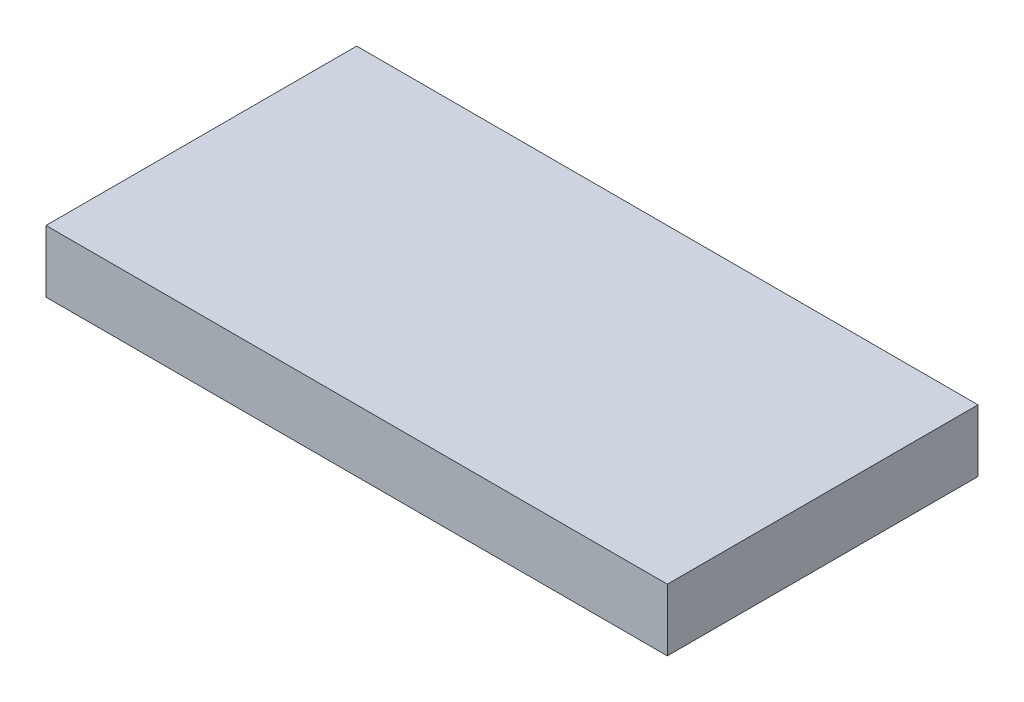
ISO-10303-21;
HEADER;
FILE_DESCRIPTION(('STEP AP214'),'2;1');
FILE_NAME('part.step','',(''),(''),'','','');
FILE_SCHEMA(('AUTOMOTIVE_DESIGN { 1 0 10303 214 1 1 1 1 }'));
ENDSEC;
DATA;
#1=APPLICATION_CONTEXT('core data for automotive mechanical design processes');
#2=APPLICATION_PROTOCOL_DEFINITION('international standard','automotive_design',2000,#1);
#3=PRODUCT_CONTEXT('',#1,'mechanical');
#4=PRODUCT('Part','Part','',(#3));
#5=PRODUCT_RELATED_PRODUCT_CATEGORY('part','',(#4));
#6=PRODUCT_DEFINITION_FORMATION('','',#4);
#7=PRODUCT_DEFINITION_CONTEXT('part definition',#1,'design');
#8=PRODUCT_DEFINITION('design','',#6,#7);
#9=PRODUCT_DEFINITION_SHAPE('','',#8);
#10=(LENGTH_UNIT() NAMED_UNIT(*) SI_UNIT(.MILLI.,.METRE.));
#11=(NAMED_UNIT(*) PLANE_ANGLE_UNIT() SI_UNIT($,.RADIAN.));
#12=(NAMED_UNIT(*) SI_UNIT($,.STERADIAN.) SOLID_ANGLE_UNIT());
#13=UNCERTAINTY_MEASURE_WITH_UNIT(LENGTH_MEASURE(1.E-05),#10,'distance_accuracy_value','');
#14=(GEOMETRIC_REPRESENTATION_CONTEXT(3) GLOBAL_UNCERTAINTY_ASSIGNED_CONTEXT((#13)) GLOBAL_UNIT_ASSIGNED_CONTEXT((#10,
#11,#12)) REPRESENTATION_CONTEXT('',''));
#15=CARTESIAN_POINT('',(0.,0.,0.));
#16=DIRECTION('',(0.,0.,1.));
#17=DIRECTION('',(1.,0.,0.));
#18=AXIS2_PLACEMENT_3D('',#15,#16,#17);
#19=CARTESIAN_POINT('',(16.,3.2,8.));
#20=DIRECTION('',(-1.,0.,0.));
#21=DIRECTION('',(0.,0.,1.));
#22=AXIS2_PLACEMENT_3D('',#19,#20,#21);
#23=PLANE('',#22);
#24=DIRECTION('',(0.,0.,-1.));
#25=VECTOR('',#24,1.);
#26=CARTESIAN_POINT('',(16.,0.,8.));
#27=LINE('',#26,#25);
#28=CARTESIAN_POINT('',(16.,0.,8.));
#29=VERTEX_POINT('',#28);
#30=CARTESIAN_POINT('',(16.,0.,-8.));
#31=VERTEX_POINT('',#30);
#32=EDGE_CURVE('E104',#29,#31,#27,.T.);
#33=ORIENTED_EDGE('',*,*,#32,.T.);
#34=DIRECTION('',(0.,-1.,0.));
#35=VECTOR('',#34,1.);
#36=CARTESIAN_POINT('',(16.,3.2,-8.));
#37=LINE('',#36,#35);
#38=CARTESIAN_POINT('',(16.,3.2,-8.));
#39=VERTEX_POINT('',#38);
#40=EDGE_CURVE('E11',#39,#31,#37,.T.);
#41=ORIENTED_EDGE('',*,*,#40,.F.);
#42=DIRECTION('',(0.,0.,-1.));
#43=VECTOR('',#42,1.);
#44=CARTESIAN_POINT('',(16.,3.2,8.));
#45=LINE('',#44,#43);
#46=CARTESIAN_POINT('',(16.,3.2,8.));
#47=VERTEX_POINT('',#46);
#48=EDGE_CURVE('E92',#47,#39,#45,.T.);
#49=ORIENTED_EDGE('',*,*,#48,.F.);
#50=DIRECTION('',(0.,-1.,0.));
#51=VECTOR('',#50,1.);
#52=CARTESIAN_POINT('',(16.,3.2,8.));
#53=LINE('',#52,#51);
#54=EDGE_CURVE('E100',#47,#29,#53,.T.);
#55=ORIENTED_EDGE('',*,*,#54,.T.);
#56=EDGE_LOOP('',(#33,#41,#49,#55));
#57=FACE_BOUND('',#56,.T.);
#58=ADVANCED_FACE('F41',(#57),#23,.F.);
#59=CARTESIAN_POINT('',(-16.,3.2,-8.));
#60=DIRECTION('',(0.,0.,1.));
#61=DIRECTION('',(1.,0.,0.));
#62=AXIS2_PLACEMENT_3D('',#59,#60,#61);
#63=PLANE('',#62);
#64=DIRECTION('',(-1.,0.,0.));
#65=VECTOR('',#64,1.);
#66=CARTESIAN_POINT('',(-16.,0.,-8.));
#67=LINE('',#66,#65);
#68=CARTESIAN_POINT('',(-16.,0.,-8.));
#69=VERTEX_POINT('',#68);
#70=EDGE_CURVE('E96',#31,#69,#67,.T.);
#71=ORIENTED_EDGE('',*,*,#70,.T.);
#72=DIRECTION('',(0.,-1.,0.));
#73=VECTOR('',#72,1.);
#74=CARTESIAN_POINT('',(-16.,3.2,-8.));
#75=LINE('',#74,#73);
#76=CARTESIAN_POINT('',(-16.,3.2,-8.));
#77=VERTEX_POINT('',#76);
#78=EDGE_CURVE('E49',#77,#69,#75,.T.);
#79=ORIENTED_EDGE('',*,*,#78,.F.);
#80=DIRECTION('',(-1.,0.,0.));
#81=VECTOR('',#80,1.);
#82=CARTESIAN_POINT('',(-16.,3.2,-8.));
#83=LINE('',#82,#81);
#84=EDGE_CURVE('E87',#39,#77,#83,.T.);
#85=ORIENTED_EDGE('',*,*,#84,.F.);
#86=ORIENTED_EDGE('',*,*,#40,.T.);
#87=EDGE_LOOP('',(#71,#79,#85,#86));
#88=FACE_BOUND('',#87,.T.);
#89=ADVANCED_FACE('F95',(#88),#63,.F.);
#90=CARTESIAN_POINT('',(-16.,3.2,8.));
#91=DIRECTION('',(1.,0.,0.));
#92=DIRECTION('',(0.,0.,-1.));
#93=AXIS2_PLACEMENT_3D('',#90,#91,#92);
#94=PLANE('',#93);
#95=DIRECTION('',(0.,0.,1.));
#96=VECTOR('',#95,1.);
#97=CARTESIAN_POINT('',(-16.,0.,8.));
#98=LINE('',#97,#96);
#99=CARTESIAN_POINT('',(-16.,0.,8.));
#100=VERTEX_POINT('',#99);
#101=EDGE_CURVE('E74',#69,#100,#98,.T.);
#102=ORIENTED_EDGE('',*,*,#101,.T.);
#103=DIRECTION('',(0.,-1.,0.));
#104=VECTOR('',#103,1.);
#105=CARTESIAN_POINT('',(-16.,3.2,8.));
#106=LINE('',#105,#104);
#107=CARTESIAN_POINT('',(-16.,3.2,8.));
#108=VERTEX_POINT('',#107);
#109=EDGE_CURVE('E97',#108,#100,#106,.T.);
#110=ORIENTED_EDGE('',*,*,#109,.F.);
#111=DIRECTION('',(0.,0.,1.));
#112=VECTOR('',#111,1.);
#113=CARTESIAN_POINT('',(-16.,3.2,8.));
#114=LINE('',#113,#112);
#115=EDGE_CURVE('E90',#77,#108,#114,.T.);
#116=ORIENTED_EDGE('',*,*,#115,.F.);
#117=ORIENTED_EDGE('',*,*,#78,.T.);
#118=EDGE_LOOP('',(#102,#110,#116,#117));
#119=FACE_BOUND('',#118,.T.);
#120=ADVANCED_FACE('F98',(#119),#94,.F.);
#121=CARTESIAN_POINT('',(-16.,3.2,8.));
#122=DIRECTION('',(0.,0.,-1.));
#123=DIRECTION('',(-1.,0.,0.));
#124=AXIS2_PLACEMENT_3D('',#121,#122,#123);
#125=PLANE('',#124);
#126=DIRECTION('',(1.,0.,0.));
#127=VECTOR('',#126,1.);
#128=CARTESIAN_POINT('',(-16.,0.,8.));
#129=LINE('',#128,#127);
#130=EDGE_CURVE('E80',#100,#29,#129,.T.);
#131=ORIENTED_EDGE('',*,*,#130,.T.);
#132=ORIENTED_EDGE('',*,*,#54,.F.);
#133=DIRECTION('',(1.,0.,0.));
#134=VECTOR('',#133,1.);
#135=CARTESIAN_POINT('',(-16.,3.2,8.));
#136=LINE('',#135,#134);
#137=EDGE_CURVE('E57',#108,#47,#136,.T.);
#138=ORIENTED_EDGE('',*,*,#137,.F.);
#139=ORIENTED_EDGE('',*,*,#109,.T.);
#140=EDGE_LOOP('',(#131,#132,#138,#139));
#141=FACE_BOUND('',#140,.T.);
#142=ADVANCED_FACE('F111',(#141),#125,.F.);
#143=CARTESIAN_POINT('',(0.,3.2,0.));
#144=DIRECTION('',(0.,-1.,0.));
#145=DIRECTION('',(0.,0.,-1.));
#146=AXIS2_PLACEMENT_3D('',#143,#144,#145);
#147=PLANE('',#146);
#148=ORIENTED_EDGE('',*,*,#48,.T.);
#149=ORIENTED_EDGE('',*,*,#84,.T.);
#150=ORIENTED_EDGE('',*,*,#115,.T.);
#151=ORIENTED_EDGE('',*,*,#137,.T.);
#152=EDGE_LOOP('',(#148,#149,#150,#151));
#153=FACE_BOUND('',#152,.T.);
#154=ADVANCED_FACE('F88',(#153),#147,.F.);
#155=CARTESIAN_POINT('',(0.,0.,0.));
#156=DIRECTION('',(0.,-1.,0.));
#157=DIRECTION('',(0.,0.,-1.));
#158=AXIS2_PLACEMENT_3D('',#155,#156,#157);
#159=PLANE('',#158);
#160=ORIENTED_EDGE('',*,*,#32,.F.);
#161=ORIENTED_EDGE('',*,*,#130,.F.);
#162=ORIENTED_EDGE('',*,*,#101,.F.);
#163=ORIENTED_EDGE('',*,*,#70,.F.);
#164=EDGE_LOOP('',(#160,#161,#162,#163));
#165=FACE_BOUND('',#164,.T.);
#166=ADVANCED_FACE('F114',(#165),#159,.T.);
#167=CLOSED_SHELL('',(#58,#89,#120,#142,#154,#166));
#168=MANIFOLD_SOLID_BREP('B2',#167);
#169=ADVANCED_BREP_SHAPE_REPRESENTATION('',(#18,#168),#14);
#170=SHAPE_DEFINITION_REPRESENTATION(#9,#169);
ENDSEC;
END-ISO-10303-21;
